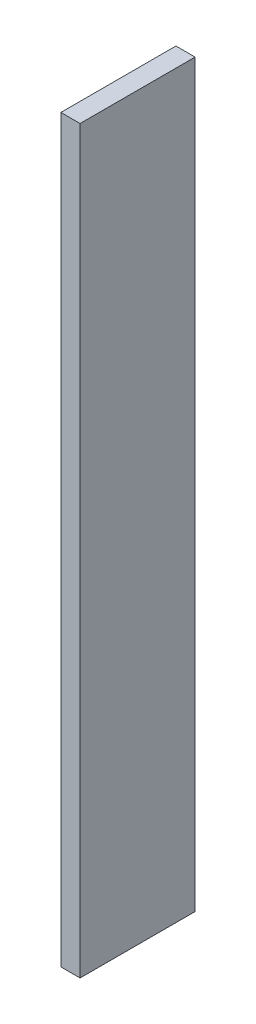
ISO-10303-21;
HEADER;
FILE_DESCRIPTION(('STEP AP214'),'2;1');
FILE_NAME('part.step','',(''),(''),'','','');
FILE_SCHEMA(('AUTOMOTIVE_DESIGN { 1 0 10303 214 1 1 1 1 }'));
ENDSEC;
DATA;
#1=APPLICATION_CONTEXT('core data for automotive mechanical design processes');
#2=APPLICATION_PROTOCOL_DEFINITION('international standard','automotive_design',2000,#1);
#3=PRODUCT_CONTEXT('',#1,'mechanical');
#4=PRODUCT('Part','Part','',(#3));
#5=PRODUCT_RELATED_PRODUCT_CATEGORY('part','',(#4));
#6=PRODUCT_DEFINITION_FORMATION('','',#4);
#7=PRODUCT_DEFINITION_CONTEXT('part definition',#1,'design');
#8=PRODUCT_DEFINITION('design','',#6,#7);
#9=PRODUCT_DEFINITION_SHAPE('','',#8);
#10=(LENGTH_UNIT() NAMED_UNIT(*) SI_UNIT(.MILLI.,.METRE.));
#11=(NAMED_UNIT(*) PLANE_ANGLE_UNIT() SI_UNIT($,.RADIAN.));
#12=(NAMED_UNIT(*) SI_UNIT($,.STERADIAN.) SOLID_ANGLE_UNIT());
#13=UNCERTAINTY_MEASURE_WITH_UNIT(LENGTH_MEASURE(1.E-05),#10,'distance_accuracy_value','');
#14=(GEOMETRIC_REPRESENTATION_CONTEXT(3) GLOBAL_UNCERTAINTY_ASSIGNED_CONTEXT((#13)) GLOBAL_UNIT_ASSIGNED_CONTEXT((#10,
#11,#12)) REPRESENTATION_CONTEXT('',''));
#15=CARTESIAN_POINT('',(0.,0.,0.));
#16=DIRECTION('',(0.,0.,1.));
#17=DIRECTION('',(1.,0.,0.));
#18=AXIS2_PLACEMENT_3D('',#15,#16,#17);
#19=CARTESIAN_POINT('',(0.,193.,0.));
#20=DIRECTION('',(1.,0.,0.));
#21=DIRECTION('',(0.,0.,-1.));
#22=AXIS2_PLACEMENT_3D('',#19,#20,#21);
#23=PLANE('',#22);
#24=DIRECTION('',(0.,0.,1.));
#25=VECTOR('',#24,1.);
#26=CARTESIAN_POINT('',(0.,0.,0.));
#27=LINE('',#26,#25);
#28=CARTESIAN_POINT('',(0.,0.,0.));
#29=VERTEX_POINT('',#28);
#30=CARTESIAN_POINT('',(0.,0.,30.));
#31=VERTEX_POINT('',#30);
#32=EDGE_CURVE('E98',#29,#31,#27,.T.);
#33=ORIENTED_EDGE('',*,*,#32,.T.);
#34=DIRECTION('',(0.,-1.,0.));
#35=VECTOR('',#34,1.);
#36=CARTESIAN_POINT('',(0.,193.,30.));
#37=LINE('',#36,#35);
#38=CARTESIAN_POINT('',(0.,193.,30.));
#39=VERTEX_POINT('',#38);
#40=EDGE_CURVE('E11',#39,#31,#37,.T.);
#41=ORIENTED_EDGE('',*,*,#40,.F.);
#42=DIRECTION('',(0.,0.,1.));
#43=VECTOR('',#42,1.);
#44=CARTESIAN_POINT('',(0.,193.,0.));
#45=LINE('',#44,#43);
#46=CARTESIAN_POINT('',(0.,193.,0.));
#47=VERTEX_POINT('',#46);
#48=EDGE_CURVE('E86',#47,#39,#45,.T.);
#49=ORIENTED_EDGE('',*,*,#48,.F.);
#50=DIRECTION('',(0.,-1.,0.));
#51=VECTOR('',#50,1.);
#52=CARTESIAN_POINT('',(0.,193.,0.));
#53=LINE('',#52,#51);
#54=EDGE_CURVE('E94',#47,#29,#53,.T.);
#55=ORIENTED_EDGE('',*,*,#54,.T.);
#56=EDGE_LOOP('',(#33,#41,#49,#55));
#57=FACE_BOUND('',#56,.T.);
#58=ADVANCED_FACE('F35',(#57),#23,.F.);
#59=CARTESIAN_POINT('',(0.,193.,30.));
#60=DIRECTION('',(0.,0.,-1.));
#61=DIRECTION('',(-1.,0.,0.));
#62=AXIS2_PLACEMENT_3D('',#59,#60,#61);
#63=PLANE('',#62);
#64=DIRECTION('',(1.,0.,0.));
#65=VECTOR('',#64,1.);
#66=CARTESIAN_POINT('',(0.,0.,30.));
#67=LINE('',#66,#65);
#68=CARTESIAN_POINT('',(5.,0.,30.));
#69=VERTEX_POINT('',#68);
#70=EDGE_CURVE('E90',#31,#69,#67,.T.);
#71=ORIENTED_EDGE('',*,*,#70,.T.);
#72=DIRECTION('',(0.,-1.,0.));
#73=VECTOR('',#72,1.);
#74=CARTESIAN_POINT('',(5.,193.,30.));
#75=LINE('',#74,#73);
#76=CARTESIAN_POINT('',(5.,193.,30.));
#77=VERTEX_POINT('',#76);
#78=EDGE_CURVE('E43',#77,#69,#75,.T.);
#79=ORIENTED_EDGE('',*,*,#78,.F.);
#80=DIRECTION('',(1.,0.,0.));
#81=VECTOR('',#80,1.);
#82=CARTESIAN_POINT('',(0.,193.,30.));
#83=LINE('',#82,#81);
#84=EDGE_CURVE('E81',#39,#77,#83,.T.);
#85=ORIENTED_EDGE('',*,*,#84,.F.);
#86=ORIENTED_EDGE('',*,*,#40,.T.);
#87=EDGE_LOOP('',(#71,#79,#85,#86));
#88=FACE_BOUND('',#87,.T.);
#89=ADVANCED_FACE('F89',(#88),#63,.F.);
#90=CARTESIAN_POINT('',(5.,193.,0.));
#91=DIRECTION('',(-1.,0.,0.));
#92=DIRECTION('',(0.,0.,1.));
#93=AXIS2_PLACEMENT_3D('',#90,#91,#92);
#94=PLANE('',#93);
#95=DIRECTION('',(0.,0.,-1.));
#96=VECTOR('',#95,1.);
#97=CARTESIAN_POINT('',(5.,0.,0.));
#98=LINE('',#97,#96);
#99=CARTESIAN_POINT('',(5.,0.,0.));
#100=VERTEX_POINT('',#99);
#101=EDGE_CURVE('E68',#69,#100,#98,.T.);
#102=ORIENTED_EDGE('',*,*,#101,.T.);
#103=DIRECTION('',(0.,-1.,0.));
#104=VECTOR('',#103,1.);
#105=CARTESIAN_POINT('',(5.,193.,0.));
#106=LINE('',#105,#104);
#107=CARTESIAN_POINT('',(5.,193.,0.));
#108=VERTEX_POINT('',#107);
#109=EDGE_CURVE('E91',#108,#100,#106,.T.);
#110=ORIENTED_EDGE('',*,*,#109,.F.);
#111=DIRECTION('',(0.,0.,-1.));
#112=VECTOR('',#111,1.);
#113=CARTESIAN_POINT('',(5.,193.,0.));
#114=LINE('',#113,#112);
#115=EDGE_CURVE('E84',#77,#108,#114,.T.);
#116=ORIENTED_EDGE('',*,*,#115,.F.);
#117=ORIENTED_EDGE('',*,*,#78,.T.);
#118=EDGE_LOOP('',(#102,#110,#116,#117));
#119=FACE_BOUND('',#118,.T.);
#120=ADVANCED_FACE('F92',(#119),#94,.F.);
#121=CARTESIAN_POINT('',(0.,193.,0.));
#122=DIRECTION('',(0.,0.,1.));
#123=DIRECTION('',(1.,0.,0.));
#124=AXIS2_PLACEMENT_3D('',#121,#122,#123);
#125=PLANE('',#124);
#126=DIRECTION('',(-1.,0.,0.));
#127=VECTOR('',#126,1.);
#128=CARTESIAN_POINT('',(0.,0.,0.));
#129=LINE('',#128,#127);
#130=EDGE_CURVE('E74',#100,#29,#129,.T.);
#131=ORIENTED_EDGE('',*,*,#130,.T.);
#132=ORIENTED_EDGE('',*,*,#54,.F.);
#133=DIRECTION('',(-1.,0.,0.));
#134=VECTOR('',#133,1.);
#135=CARTESIAN_POINT('',(0.,193.,0.));
#136=LINE('',#135,#134);
#137=EDGE_CURVE('E51',#108,#47,#136,.T.);
#138=ORIENTED_EDGE('',*,*,#137,.F.);
#139=ORIENTED_EDGE('',*,*,#109,.T.);
#140=EDGE_LOOP('',(#131,#132,#138,#139));
#141=FACE_BOUND('',#140,.T.);
#142=ADVANCED_FACE('F105',(#141),#125,.F.);
#143=CARTESIAN_POINT('',(0.,193.,0.));
#144=DIRECTION('',(0.,1.,0.));
#145=DIRECTION('',(0.,0.,1.));
#146=AXIS2_PLACEMENT_3D('',#143,#144,#145);
#147=PLANE('',#146);
#148=ORIENTED_EDGE('',*,*,#48,.T.);
#149=ORIENTED_EDGE('',*,*,#84,.T.);
#150=ORIENTED_EDGE('',*,*,#115,.T.);
#151=ORIENTED_EDGE('',*,*,#137,.T.);
#152=EDGE_LOOP('',(#148,#149,#150,#151));
#153=FACE_BOUND('',#152,.T.);
#154=ADVANCED_FACE('F82',(#153),#147,.T.);
#155=CARTESIAN_POINT('',(0.,0.,0.));
#156=DIRECTION('',(0.,1.,0.));
#157=DIRECTION('',(0.,0.,1.));
#158=AXIS2_PLACEMENT_3D('',#155,#156,#157);
#159=PLANE('',#158);
#160=ORIENTED_EDGE('',*,*,#32,.F.);
#161=ORIENTED_EDGE('',*,*,#130,.F.);
#162=ORIENTED_EDGE('',*,*,#101,.F.);
#163=ORIENTED_EDGE('',*,*,#70,.F.);
#164=EDGE_LOOP('',(#160,#161,#162,#163));
#165=FACE_BOUND('',#164,.T.);
#166=ADVANCED_FACE('F108',(#165),#159,.F.);
#167=CLOSED_SHELL('',(#58,#89,#120,#142,#154,#166));
#168=MANIFOLD_SOLID_BREP('B2',#167);
#169=ADVANCED_BREP_SHAPE_REPRESENTATION('',(#18,#168),#14);
#170=SHAPE_DEFINITION_REPRESENTATION(#9,#169);
ENDSEC;
END-ISO-10303-21;
